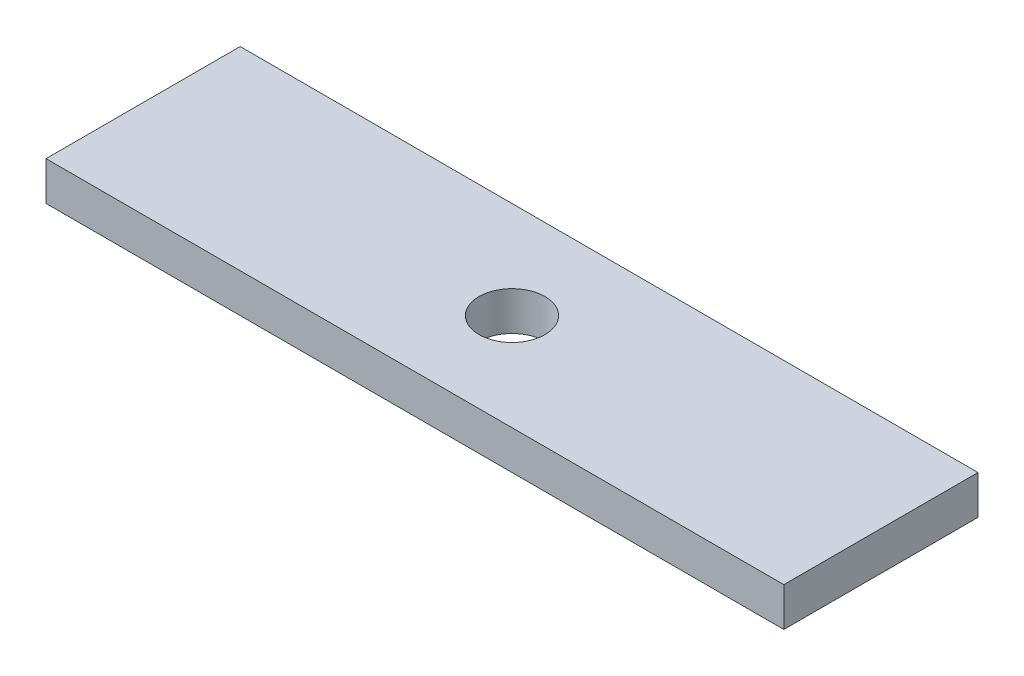
ISO-10303-21;
HEADER;
FILE_DESCRIPTION(('STEP AP214'),'2;1');
FILE_NAME('part.step','',(''),(''),'','','');
FILE_SCHEMA(('AUTOMOTIVE_DESIGN { 1 0 10303 214 1 1 1 1 }'));
ENDSEC;
DATA;
#1=APPLICATION_CONTEXT('core data for automotive mechanical design processes');
#2=APPLICATION_PROTOCOL_DEFINITION('international standard','automotive_design',2000,#1);
#3=PRODUCT_CONTEXT('',#1,'mechanical');
#4=PRODUCT('Part','Part','',(#3));
#5=PRODUCT_RELATED_PRODUCT_CATEGORY('part','',(#4));
#6=PRODUCT_DEFINITION_FORMATION('','',#4);
#7=PRODUCT_DEFINITION_CONTEXT('part definition',#1,'design');
#8=PRODUCT_DEFINITION('design','',#6,#7);
#9=PRODUCT_DEFINITION_SHAPE('','',#8);
#10=(LENGTH_UNIT() NAMED_UNIT(*) SI_UNIT(.MILLI.,.METRE.));
#11=(NAMED_UNIT(*) PLANE_ANGLE_UNIT() SI_UNIT($,.RADIAN.));
#12=(NAMED_UNIT(*) SI_UNIT($,.STERADIAN.) SOLID_ANGLE_UNIT());
#13=UNCERTAINTY_MEASURE_WITH_UNIT(LENGTH_MEASURE(1.E-05),#10,'distance_accuracy_value','');
#14=(GEOMETRIC_REPRESENTATION_CONTEXT(3) GLOBAL_UNCERTAINTY_ASSIGNED_CONTEXT((#13)) GLOBAL_UNIT_ASSIGNED_CONTEXT((#10,
#11,#12)) REPRESENTATION_CONTEXT('',''));
#15=CARTESIAN_POINT('',(0.,0.,0.));
#16=DIRECTION('',(0.,0.,1.));
#17=DIRECTION('',(1.,0.,0.));
#18=AXIS2_PLACEMENT_3D('',#15,#16,#17);
#19=CARTESIAN_POINT('',(47.5,5.,12.5));
#20=DIRECTION('',(-1.,0.,0.));
#21=DIRECTION('',(0.,0.,1.));
#22=AXIS2_PLACEMENT_3D('',#19,#20,#21);
#23=PLANE('',#22);
#24=DIRECTION('',(0.,0.,-1.));
#25=VECTOR('',#24,1.);
#26=CARTESIAN_POINT('',(47.5,0.,12.5));
#27=LINE('',#26,#25);
#28=CARTESIAN_POINT('',(47.5,0.,12.5));
#29=VERTEX_POINT('',#28);
#30=CARTESIAN_POINT('',(47.5,0.,-12.5));
#31=VERTEX_POINT('',#30);
#32=EDGE_CURVE('E108',#29,#31,#27,.T.);
#33=ORIENTED_EDGE('',*,*,#32,.T.);
#34=DIRECTION('',(0.,-1.,0.));
#35=VECTOR('',#34,1.);
#36=CARTESIAN_POINT('',(47.5,5.,-12.5));
#37=LINE('',#36,#35);
#38=CARTESIAN_POINT('',(47.5,5.,-12.5));
#39=VERTEX_POINT('',#38);
#40=EDGE_CURVE('E11',#39,#31,#37,.T.);
#41=ORIENTED_EDGE('',*,*,#40,.F.);
#42=DIRECTION('',(0.,0.,-1.));
#43=VECTOR('',#42,1.);
#44=CARTESIAN_POINT('',(47.5,5.,12.5));
#45=LINE('',#44,#43);
#46=CARTESIAN_POINT('',(47.5,5.,12.5));
#47=VERTEX_POINT('',#46);
#48=EDGE_CURVE('E96',#47,#39,#45,.T.);
#49=ORIENTED_EDGE('',*,*,#48,.F.);
#50=DIRECTION('',(0.,-1.,0.));
#51=VECTOR('',#50,1.);
#52=CARTESIAN_POINT('',(47.5,5.,12.5));
#53=LINE('',#52,#51);
#54=EDGE_CURVE('E104',#47,#29,#53,.T.);
#55=ORIENTED_EDGE('',*,*,#54,.T.);
#56=EDGE_LOOP('',(#33,#41,#49,#55));
#57=FACE_BOUND('',#56,.T.);
#58=ADVANCED_FACE('F45',(#57),#23,.F.);
#59=CARTESIAN_POINT('',(-47.5,5.,-12.5));
#60=DIRECTION('',(0.,0.,1.));
#61=DIRECTION('',(1.,0.,0.));
#62=AXIS2_PLACEMENT_3D('',#59,#60,#61);
#63=PLANE('',#62);
#64=DIRECTION('',(-1.,0.,0.));
#65=VECTOR('',#64,1.);
#66=CARTESIAN_POINT('',(-47.5,0.,-12.5));
#67=LINE('',#66,#65);
#68=CARTESIAN_POINT('',(-47.5,0.,-12.5));
#69=VERTEX_POINT('',#68);
#70=EDGE_CURVE('E100',#31,#69,#67,.T.);
#71=ORIENTED_EDGE('',*,*,#70,.T.);
#72=DIRECTION('',(0.,-1.,0.));
#73=VECTOR('',#72,1.);
#74=CARTESIAN_POINT('',(-47.5,5.,-12.5));
#75=LINE('',#74,#73);
#76=CARTESIAN_POINT('',(-47.5,5.,-12.5));
#77=VERTEX_POINT('',#76);
#78=EDGE_CURVE('E53',#77,#69,#75,.T.);
#79=ORIENTED_EDGE('',*,*,#78,.F.);
#80=DIRECTION('',(-1.,0.,0.));
#81=VECTOR('',#80,1.);
#82=CARTESIAN_POINT('',(-47.5,5.,-12.5));
#83=LINE('',#82,#81);
#84=EDGE_CURVE('E91',#39,#77,#83,.T.);
#85=ORIENTED_EDGE('',*,*,#84,.F.);
#86=ORIENTED_EDGE('',*,*,#40,.T.);
#87=EDGE_LOOP('',(#71,#79,#85,#86));
#88=FACE_BOUND('',#87,.T.);
#89=ADVANCED_FACE('F99',(#88),#63,.F.);
#90=CARTESIAN_POINT('',(-47.5,5.,12.5));
#91=DIRECTION('',(1.,0.,0.));
#92=DIRECTION('',(0.,0.,-1.));
#93=AXIS2_PLACEMENT_3D('',#90,#91,#92);
#94=PLANE('',#93);
#95=DIRECTION('',(0.,0.,1.));
#96=VECTOR('',#95,1.);
#97=CARTESIAN_POINT('',(-47.5,0.,12.5));
#98=LINE('',#97,#96);
#99=CARTESIAN_POINT('',(-47.5,0.,12.5));
#100=VERTEX_POINT('',#99);
#101=EDGE_CURVE('E78',#69,#100,#98,.T.);
#102=ORIENTED_EDGE('',*,*,#101,.T.);
#103=DIRECTION('',(0.,-1.,0.));
#104=VECTOR('',#103,1.);
#105=CARTESIAN_POINT('',(-47.5,5.,12.5));
#106=LINE('',#105,#104);
#107=CARTESIAN_POINT('',(-47.5,5.,12.5));
#108=VERTEX_POINT('',#107);
#109=EDGE_CURVE('E101',#108,#100,#106,.T.);
#110=ORIENTED_EDGE('',*,*,#109,.F.);
#111=DIRECTION('',(0.,0.,1.));
#112=VECTOR('',#111,1.);
#113=CARTESIAN_POINT('',(-47.5,5.,12.5));
#114=LINE('',#113,#112);
#115=EDGE_CURVE('E94',#77,#108,#114,.T.);
#116=ORIENTED_EDGE('',*,*,#115,.F.);
#117=ORIENTED_EDGE('',*,*,#78,.T.);
#118=EDGE_LOOP('',(#102,#110,#116,#117));
#119=FACE_BOUND('',#118,.T.);
#120=ADVANCED_FACE('F102',(#119),#94,.F.);
#121=CARTESIAN_POINT('',(-47.5,5.,12.5));
#122=DIRECTION('',(0.,0.,-1.));
#123=DIRECTION('',(-1.,0.,0.));
#124=AXIS2_PLACEMENT_3D('',#121,#122,#123);
#125=PLANE('',#124);
#126=DIRECTION('',(1.,0.,0.));
#127=VECTOR('',#126,1.);
#128=CARTESIAN_POINT('',(-47.5,0.,12.5));
#129=LINE('',#128,#127);
#130=EDGE_CURVE('E84',#100,#29,#129,.T.);
#131=ORIENTED_EDGE('',*,*,#130,.T.);
#132=ORIENTED_EDGE('',*,*,#54,.F.);
#133=DIRECTION('',(1.,0.,0.));
#134=VECTOR('',#133,1.);
#135=CARTESIAN_POINT('',(-47.5,5.,12.5));
#136=LINE('',#135,#134);
#137=EDGE_CURVE('E61',#108,#47,#136,.T.);
#138=ORIENTED_EDGE('',*,*,#137,.F.);
#139=ORIENTED_EDGE('',*,*,#109,.T.);
#140=EDGE_LOOP('',(#131,#132,#138,#139));
#141=FACE_BOUND('',#140,.T.);
#142=ADVANCED_FACE('F116',(#141),#125,.F.);
#143=CARTESIAN_POINT('',(0.,5.,0.));
#144=DIRECTION('',(0.,-1.,0.));
#145=DIRECTION('',(0.,0.,-1.));
#146=AXIS2_PLACEMENT_3D('',#143,#144,#145);
#147=PLANE('',#146);
#148=CARTESIAN_POINT('',(0.,5.,0.));
#149=DIRECTION('',(0.,-1.,0.));
#150=DIRECTION('',(0.,0.,-1.));
#151=AXIS2_PLACEMENT_3D('',#148,#149,#150);
#152=CIRCLE('',#151,4.25);
#153=CARTESIAN_POINT('',(0.,5.,-4.25));
#154=VERTEX_POINT('',#153);
#155=EDGE_CURVE('E111',#154,#154,#152,.T.);
#156=ORIENTED_EDGE('',*,*,#155,.T.);
#157=EDGE_LOOP('',(#156));
#158=FACE_BOUND('',#157,.T.);
#159=ORIENTED_EDGE('',*,*,#48,.T.);
#160=ORIENTED_EDGE('',*,*,#84,.T.);
#161=ORIENTED_EDGE('',*,*,#115,.T.);
#162=ORIENTED_EDGE('',*,*,#137,.T.);
#163=EDGE_LOOP('',(#159,#160,#161,#162));
#164=FACE_BOUND('',#163,.T.);
#165=ADVANCED_FACE('F92',(#158,#164),#147,.F.);
#166=CARTESIAN_POINT('',(0.,0.,0.));
#167=DIRECTION('',(0.,-1.,0.));
#168=DIRECTION('',(0.,0.,-1.));
#169=AXIS2_PLACEMENT_3D('',#166,#167,#168);
#170=PLANE('',#169);
#171=CARTESIAN_POINT('',(0.,0.,0.));
#172=DIRECTION('',(0.,-1.,0.));
#173=DIRECTION('',(0.,0.,-1.));
#174=AXIS2_PLACEMENT_3D('',#171,#172,#173);
#175=CIRCLE('',#174,4.25);
#176=CARTESIAN_POINT('',(0.,0.,-4.25));
#177=VERTEX_POINT('',#176);
#178=EDGE_CURVE('E124',#177,#177,#175,.T.);
#179=ORIENTED_EDGE('',*,*,#178,.F.);
#180=EDGE_LOOP('',(#179));
#181=FACE_BOUND('',#180,.T.);
#182=ORIENTED_EDGE('',*,*,#32,.F.);
#183=ORIENTED_EDGE('',*,*,#130,.F.);
#184=ORIENTED_EDGE('',*,*,#101,.F.);
#185=ORIENTED_EDGE('',*,*,#70,.F.);
#186=EDGE_LOOP('',(#182,#183,#184,#185));
#187=FACE_BOUND('',#186,.T.);
#188=ADVANCED_FACE('F119',(#181,#187),#170,.T.);
#189=CARTESIAN_POINT('',(0.,0.,0.));
#190=DIRECTION('',(0.,-1.,0.));
#191=DIRECTION('',(0.,0.,-1.));
#192=AXIS2_PLACEMENT_3D('',#189,#190,#191);
#193=CYLINDRICAL_SURFACE('',#192,4.25);
#194=ORIENTED_EDGE('',*,*,#155,.F.);
#195=EDGE_LOOP('',(#194));
#196=FACE_BOUND('',#195,.T.);
#197=ORIENTED_EDGE('',*,*,#178,.T.);
#198=EDGE_LOOP('',(#197));
#199=FACE_BOUND('',#198,.T.);
#200=ADVANCED_FACE('F128',(#196,#199),#193,.F.);
#201=CLOSED_SHELL('',(#58,#89,#120,#142,#165,#188,#200));
#202=MANIFOLD_SOLID_BREP('B2',#201);
#203=ADVANCED_BREP_SHAPE_REPRESENTATION('',(#18,#202),#14);
#204=SHAPE_DEFINITION_REPRESENTATION(#9,#203);
ENDSEC;
END-ISO-10303-21;
